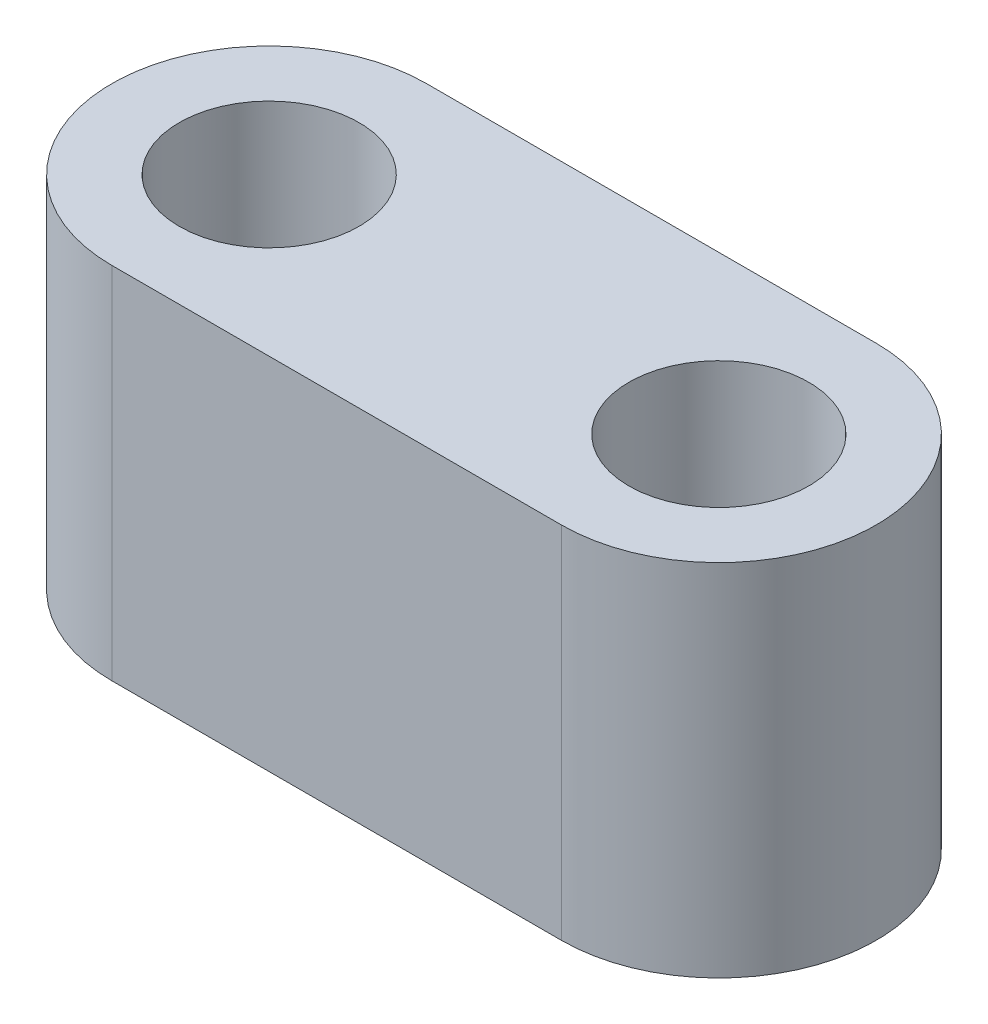
ISO-10303-21;
HEADER;
FILE_DESCRIPTION(('STEP AP214'),'2;1');
FILE_NAME('part.step','',(''),(''),'','','');
FILE_SCHEMA(('AUTOMOTIVE_DESIGN { 1 0 10303 214 1 1 1 1 }'));
ENDSEC;
DATA;
#1=APPLICATION_CONTEXT('core data for automotive mechanical design processes');
#2=APPLICATION_PROTOCOL_DEFINITION('international standard','automotive_design',2000,#1);
#3=PRODUCT_CONTEXT('',#1,'mechanical');
#4=PRODUCT('Part','Part','',(#3));
#5=PRODUCT_RELATED_PRODUCT_CATEGORY('part','',(#4));
#6=PRODUCT_DEFINITION_FORMATION('','',#4);
#7=PRODUCT_DEFINITION_CONTEXT('part definition',#1,'design');
#8=PRODUCT_DEFINITION('design','',#6,#7);
#9=PRODUCT_DEFINITION_SHAPE('','',#8);
#10=(LENGTH_UNIT() NAMED_UNIT(*) SI_UNIT(.MILLI.,.METRE.));
#11=(NAMED_UNIT(*) PLANE_ANGLE_UNIT() SI_UNIT($,.RADIAN.));
#12=(NAMED_UNIT(*) SI_UNIT($,.STERADIAN.) SOLID_ANGLE_UNIT());
#13=UNCERTAINTY_MEASURE_WITH_UNIT(LENGTH_MEASURE(1.E-05),#10,'distance_accuracy_value','');
#14=(GEOMETRIC_REPRESENTATION_CONTEXT(3) GLOBAL_UNCERTAINTY_ASSIGNED_CONTEXT((#13)) GLOBAL_UNIT_ASSIGNED_CONTEXT((#10,
#11,#12)) REPRESENTATION_CONTEXT('',''));
#15=CARTESIAN_POINT('',(0.,0.,0.));
#16=DIRECTION('',(0.,0.,1.));
#17=DIRECTION('',(1.,0.,0.));
#18=AXIS2_PLACEMENT_3D('',#15,#16,#17);
#19=CARTESIAN_POINT('',(-2.5,4.,0.));
#20=DIRECTION('',(0.,1.,0.));
#21=DIRECTION('',(0.,0.,1.));
#22=AXIS2_PLACEMENT_3D('',#19,#20,#21);
#23=PLANE('',#22);
#24=CARTESIAN_POINT('',(2.5,4.,0.));
#25=DIRECTION('',(0.,1.,0.));
#26=DIRECTION('',(0.,0.,1.));
#27=AXIS2_PLACEMENT_3D('',#24,#25,#26);
#28=CIRCLE('',#27,1.);
#29=CARTESIAN_POINT('',(2.5,4.,0.999999999999999));
#30=VERTEX_POINT('',#29);
#31=EDGE_CURVE('E106',#30,#30,#28,.T.);
#32=ORIENTED_EDGE('',*,*,#31,.F.);
#33=EDGE_LOOP('',(#32));
#34=FACE_BOUND('',#33,.T.);
#35=CARTESIAN_POINT('',(-2.5,4.,0.));
#36=DIRECTION('',(0.,1.,0.));
#37=DIRECTION('',(0.,0.,1.));
#38=AXIS2_PLACEMENT_3D('',#35,#36,#37);
#39=CIRCLE('',#38,1.75);
#40=CARTESIAN_POINT('',(-2.5,4.,-1.75));
#41=VERTEX_POINT('',#40);
#42=CARTESIAN_POINT('',(-2.5,4.,1.75));
#43=VERTEX_POINT('',#42);
#44=EDGE_CURVE('E91',#41,#43,#39,.T.);
#45=ORIENTED_EDGE('',*,*,#44,.T.);
#46=DIRECTION('',(1.,0.,0.));
#47=VECTOR('',#46,1.);
#48=CARTESIAN_POINT('',(-2.5,4.,1.75));
#49=LINE('',#48,#47);
#50=CARTESIAN_POINT('',(2.5,4.,1.75));
#51=VERTEX_POINT('',#50);
#52=EDGE_CURVE('E86',#43,#51,#49,.T.);
#53=ORIENTED_EDGE('',*,*,#52,.T.);
#54=CARTESIAN_POINT('',(2.5,4.,0.));
#55=DIRECTION('',(0.,1.,0.));
#56=DIRECTION('',(0.,0.,1.));
#57=AXIS2_PLACEMENT_3D('',#54,#55,#56);
#58=CIRCLE('',#57,1.75);
#59=CARTESIAN_POINT('',(2.5,4.,-1.75));
#60=VERTEX_POINT('',#59);
#61=EDGE_CURVE('E89',#51,#60,#58,.T.);
#62=ORIENTED_EDGE('',*,*,#61,.T.);
#63=DIRECTION('',(-1.,0.,0.));
#64=VECTOR('',#63,1.);
#65=CARTESIAN_POINT('',(-2.5,4.,-1.75));
#66=LINE('',#65,#64);
#67=EDGE_CURVE('E56',#60,#41,#66,.T.);
#68=ORIENTED_EDGE('',*,*,#67,.T.);
#69=EDGE_LOOP('',(#45,#53,#62,#68));
#70=FACE_BOUND('',#69,.T.);
#71=CARTESIAN_POINT('',(-2.5,4.,0.));
#72=DIRECTION('',(0.,1.,0.));
#73=DIRECTION('',(0.,0.,1.));
#74=AXIS2_PLACEMENT_3D('',#71,#72,#73);
#75=CIRCLE('',#74,1.);
#76=CARTESIAN_POINT('',(-2.5,4.,1.));
#77=VERTEX_POINT('',#76);
#78=EDGE_CURVE('E121',#77,#77,#75,.T.);
#79=ORIENTED_EDGE('',*,*,#78,.F.);
#80=EDGE_LOOP('',(#79));
#81=FACE_BOUND('',#80,.T.);
#82=ADVANCED_FACE('F39',(#34,#70,#81),#23,.T.);
#83=CARTESIAN_POINT('',(-2.5,0.,0.));
#84=DIRECTION('',(0.,1.,0.));
#85=DIRECTION('',(0.,0.,1.));
#86=AXIS2_PLACEMENT_3D('',#83,#84,#85);
#87=PLANE('',#86);
#88=CARTESIAN_POINT('',(-2.5,0.,0.));
#89=DIRECTION('',(0.,1.,0.));
#90=DIRECTION('',(0.,0.,1.));
#91=AXIS2_PLACEMENT_3D('',#88,#89,#90);
#92=CIRCLE('',#91,1.75);
#93=CARTESIAN_POINT('',(-2.5,0.,-1.75));
#94=VERTEX_POINT('',#93);
#95=CARTESIAN_POINT('',(-2.5,0.,1.75));
#96=VERTEX_POINT('',#95);
#97=EDGE_CURVE('E103',#94,#96,#92,.T.);
#98=ORIENTED_EDGE('',*,*,#97,.F.);
#99=DIRECTION('',(-1.,0.,0.));
#100=VECTOR('',#99,1.);
#101=CARTESIAN_POINT('',(-2.5,0.,-1.75));
#102=LINE('',#101,#100);
#103=CARTESIAN_POINT('',(2.5,0.,-1.75));
#104=VERTEX_POINT('',#103);
#105=EDGE_CURVE('E79',#104,#94,#102,.T.);
#106=ORIENTED_EDGE('',*,*,#105,.F.);
#107=CARTESIAN_POINT('',(2.5,0.,0.));
#108=DIRECTION('',(0.,1.,0.));
#109=DIRECTION('',(0.,0.,1.));
#110=AXIS2_PLACEMENT_3D('',#107,#108,#109);
#111=CIRCLE('',#110,1.75);
#112=CARTESIAN_POINT('',(2.5,0.,1.75));
#113=VERTEX_POINT('',#112);
#114=EDGE_CURVE('E73',#113,#104,#111,.T.);
#115=ORIENTED_EDGE('',*,*,#114,.F.);
#116=DIRECTION('',(1.,0.,0.));
#117=VECTOR('',#116,1.);
#118=CARTESIAN_POINT('',(-2.5,0.,1.75));
#119=LINE('',#118,#117);
#120=EDGE_CURVE('E95',#96,#113,#119,.T.);
#121=ORIENTED_EDGE('',*,*,#120,.F.);
#122=EDGE_LOOP('',(#98,#106,#115,#121));
#123=FACE_BOUND('',#122,.T.);
#124=CARTESIAN_POINT('',(2.5,0.,0.));
#125=DIRECTION('',(0.,1.,0.));
#126=DIRECTION('',(0.,0.,1.));
#127=AXIS2_PLACEMENT_3D('',#124,#125,#126);
#128=CIRCLE('',#127,1.);
#129=CARTESIAN_POINT('',(2.5,0.,0.999999999999999));
#130=VERTEX_POINT('',#129);
#131=EDGE_CURVE('E118',#130,#130,#128,.T.);
#132=ORIENTED_EDGE('',*,*,#131,.T.);
#133=EDGE_LOOP('',(#132));
#134=FACE_BOUND('',#133,.T.);
#135=CARTESIAN_POINT('',(-2.5,0.,0.));
#136=DIRECTION('',(0.,1.,0.));
#137=DIRECTION('',(0.,0.,1.));
#138=AXIS2_PLACEMENT_3D('',#135,#136,#137);
#139=CIRCLE('',#138,1.);
#140=CARTESIAN_POINT('',(-2.5,0.,1.));
#141=VERTEX_POINT('',#140);
#142=EDGE_CURVE('E124',#141,#141,#139,.T.);
#143=ORIENTED_EDGE('',*,*,#142,.T.);
#144=EDGE_LOOP('',(#143));
#145=FACE_BOUND('',#144,.T.);
#146=ADVANCED_FACE('F114',(#123,#134,#145),#87,.F.);
#147=CARTESIAN_POINT('',(-2.5,4.,0.));
#148=DIRECTION('',(0.,-1.,0.));
#149=DIRECTION('',(0.,0.,-1.));
#150=AXIS2_PLACEMENT_3D('',#147,#148,#149);
#151=CYLINDRICAL_SURFACE('',#150,1.75);
#152=ORIENTED_EDGE('',*,*,#97,.T.);
#153=DIRECTION('',(0.,-1.,0.));
#154=VECTOR('',#153,1.);
#155=CARTESIAN_POINT('',(-2.5,4.,1.75));
#156=LINE('',#155,#154);
#157=EDGE_CURVE('E11',#43,#96,#156,.T.);
#158=ORIENTED_EDGE('',*,*,#157,.F.);
#159=ORIENTED_EDGE('',*,*,#44,.F.);
#160=DIRECTION('',(0.,-1.,0.));
#161=VECTOR('',#160,1.);
#162=CARTESIAN_POINT('',(-2.5,4.,-1.75));
#163=LINE('',#162,#161);
#164=EDGE_CURVE('E99',#41,#94,#163,.T.);
#165=ORIENTED_EDGE('',*,*,#164,.T.);
#166=EDGE_LOOP('',(#152,#158,#159,#165));
#167=FACE_BOUND('',#166,.T.);
#168=ADVANCED_FACE('F41',(#167),#151,.T.);
#169=CARTESIAN_POINT('',(-2.5,4.,1.75));
#170=DIRECTION('',(0.,0.,-1.));
#171=DIRECTION('',(-1.,0.,0.));
#172=AXIS2_PLACEMENT_3D('',#169,#170,#171);
#173=PLANE('',#172);
#174=ORIENTED_EDGE('',*,*,#120,.T.);
#175=DIRECTION('',(0.,-1.,0.));
#176=VECTOR('',#175,1.);
#177=CARTESIAN_POINT('',(2.5,4.,1.75));
#178=LINE('',#177,#176);
#179=EDGE_CURVE('E48',#51,#113,#178,.T.);
#180=ORIENTED_EDGE('',*,*,#179,.F.);
#181=ORIENTED_EDGE('',*,*,#52,.F.);
#182=ORIENTED_EDGE('',*,*,#157,.T.);
#183=EDGE_LOOP('',(#174,#180,#181,#182));
#184=FACE_BOUND('',#183,.T.);
#185=ADVANCED_FACE('F94',(#184),#173,.F.);
#186=CARTESIAN_POINT('',(2.5,4.,0.));
#187=DIRECTION('',(0.,-1.,0.));
#188=DIRECTION('',(0.,0.,-1.));
#189=AXIS2_PLACEMENT_3D('',#186,#187,#188);
#190=CYLINDRICAL_SURFACE('',#189,1.75);
#191=ORIENTED_EDGE('',*,*,#114,.T.);
#192=DIRECTION('',(0.,-1.,0.));
#193=VECTOR('',#192,1.);
#194=CARTESIAN_POINT('',(2.5,4.,-1.75));
#195=LINE('',#194,#193);
#196=EDGE_CURVE('E96',#60,#104,#195,.T.);
#197=ORIENTED_EDGE('',*,*,#196,.F.);
#198=ORIENTED_EDGE('',*,*,#61,.F.);
#199=ORIENTED_EDGE('',*,*,#179,.T.);
#200=EDGE_LOOP('',(#191,#197,#198,#199));
#201=FACE_BOUND('',#200,.T.);
#202=ADVANCED_FACE('F97',(#201),#190,.T.);
#203=CARTESIAN_POINT('',(-2.5,4.,-1.75));
#204=DIRECTION('',(0.,0.,1.));
#205=DIRECTION('',(1.,0.,0.));
#206=AXIS2_PLACEMENT_3D('',#203,#204,#205);
#207=PLANE('',#206);
#208=ORIENTED_EDGE('',*,*,#105,.T.);
#209=ORIENTED_EDGE('',*,*,#164,.F.);
#210=ORIENTED_EDGE('',*,*,#67,.F.);
#211=ORIENTED_EDGE('',*,*,#196,.T.);
#212=EDGE_LOOP('',(#208,#209,#210,#211));
#213=FACE_BOUND('',#212,.T.);
#214=ADVANCED_FACE('F111',(#213),#207,.F.);
#215=CARTESIAN_POINT('',(2.5,4.,0.));
#216=DIRECTION('',(0.,-1.,0.));
#217=DIRECTION('',(0.,0.,-1.));
#218=AXIS2_PLACEMENT_3D('',#215,#216,#217);
#219=CYLINDRICAL_SURFACE('',#218,1.);
#220=ORIENTED_EDGE('',*,*,#31,.T.);
#221=EDGE_LOOP('',(#220));
#222=FACE_BOUND('',#221,.T.);
#223=ORIENTED_EDGE('',*,*,#131,.F.);
#224=EDGE_LOOP('',(#223));
#225=FACE_BOUND('',#224,.T.);
#226=ADVANCED_FACE('F141',(#222,#225),#219,.F.);
#227=CARTESIAN_POINT('',(-2.5,4.,0.));
#228=DIRECTION('',(0.,-1.,0.));
#229=DIRECTION('',(0.,0.,-1.));
#230=AXIS2_PLACEMENT_3D('',#227,#228,#229);
#231=CYLINDRICAL_SURFACE('',#230,1.);
#232=ORIENTED_EDGE('',*,*,#78,.T.);
#233=EDGE_LOOP('',(#232));
#234=FACE_BOUND('',#233,.T.);
#235=ORIENTED_EDGE('',*,*,#142,.F.);
#236=EDGE_LOOP('',(#235));
#237=FACE_BOUND('',#236,.T.);
#238=ADVANCED_FACE('F130',(#234,#237),#231,.F.);
#239=CLOSED_SHELL('',(#82,#146,#168,#185,#202,#214,#226,#238));
#240=MANIFOLD_SOLID_BREP('B2',#239);
#241=ADVANCED_BREP_SHAPE_REPRESENTATION('',(#18,#240),#14);
#242=SHAPE_DEFINITION_REPRESENTATION(#9,#241);
ENDSEC;
END-ISO-10303-21;
